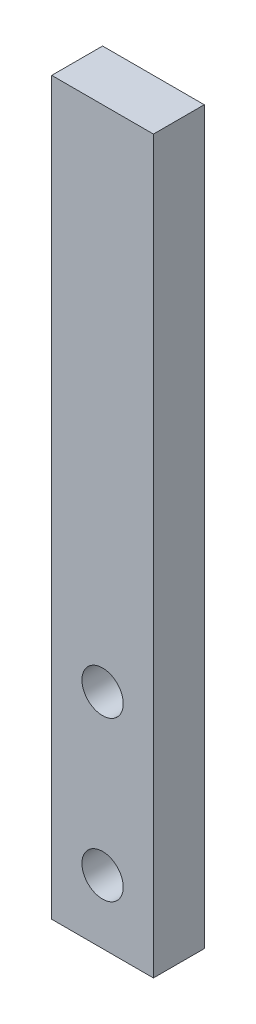
ISO-10303-21;
HEADER;
FILE_DESCRIPTION(('STEP AP214'),'2;1');
FILE_NAME('part.step','',(''),(''),'','','');
FILE_SCHEMA(('AUTOMOTIVE_DESIGN { 1 0 10303 214 1 1 1 1 }'));
ENDSEC;
DATA;
#1=APPLICATION_CONTEXT('core data for automotive mechanical design processes');
#2=APPLICATION_PROTOCOL_DEFINITION('international standard','automotive_design',2000,#1);
#3=PRODUCT_CONTEXT('',#1,'mechanical');
#4=PRODUCT('Part','Part','',(#3));
#5=PRODUCT_RELATED_PRODUCT_CATEGORY('part','',(#4));
#6=PRODUCT_DEFINITION_FORMATION('','',#4);
#7=PRODUCT_DEFINITION_CONTEXT('part definition',#1,'design');
#8=PRODUCT_DEFINITION('design','',#6,#7);
#9=PRODUCT_DEFINITION_SHAPE('','',#8);
#10=(LENGTH_UNIT() NAMED_UNIT(*) SI_UNIT(.MILLI.,.METRE.));
#11=(NAMED_UNIT(*) PLANE_ANGLE_UNIT() SI_UNIT($,.RADIAN.));
#12=(NAMED_UNIT(*) SI_UNIT($,.STERADIAN.) SOLID_ANGLE_UNIT());
#13=UNCERTAINTY_MEASURE_WITH_UNIT(LENGTH_MEASURE(1.E-05),#10,'distance_accuracy_value','');
#14=(GEOMETRIC_REPRESENTATION_CONTEXT(3) GLOBAL_UNCERTAINTY_ASSIGNED_CONTEXT((#13)) GLOBAL_UNIT_ASSIGNED_CONTEXT((#10,
#11,#12)) REPRESENTATION_CONTEXT('',''));
#15=CARTESIAN_POINT('',(0.,0.,0.));
#16=DIRECTION('',(0.,0.,1.));
#17=DIRECTION('',(1.,0.,0.));
#18=AXIS2_PLACEMENT_3D('',#15,#16,#17);
#19=CARTESIAN_POINT('',(8.,-57.5,8.));
#20=DIRECTION('',(0.,-1.,0.));
#21=DIRECTION('',(0.,0.,-1.));
#22=AXIS2_PLACEMENT_3D('',#19,#20,#21);
#23=PLANE('',#22);
#24=DIRECTION('',(-1.,0.,0.));
#25=VECTOR('',#24,1.);
#26=CARTESIAN_POINT('',(8.,-57.5,0.));
#27=LINE('',#26,#25);
#28=CARTESIAN_POINT('',(8.,-57.5,0.));
#29=VERTEX_POINT('',#28);
#30=CARTESIAN_POINT('',(-8.,-57.5,0.));
#31=VERTEX_POINT('',#30);
#32=EDGE_CURVE('E120',#29,#31,#27,.T.);
#33=ORIENTED_EDGE('',*,*,#32,.F.);
#34=DIRECTION('',(0.,0.,-1.));
#35=VECTOR('',#34,1.);
#36=CARTESIAN_POINT('',(8.,-57.5,8.));
#37=LINE('',#36,#35);
#38=CARTESIAN_POINT('',(8.,-57.5,8.));
#39=VERTEX_POINT('',#38);
#40=EDGE_CURVE('E11',#39,#29,#37,.T.);
#41=ORIENTED_EDGE('',*,*,#40,.F.);
#42=DIRECTION('',(-1.,0.,0.));
#43=VECTOR('',#42,1.);
#44=CARTESIAN_POINT('',(8.,-57.5,8.));
#45=LINE('',#44,#43);
#46=CARTESIAN_POINT('',(-8.,-57.5,8.));
#47=VERTEX_POINT('',#46);
#48=EDGE_CURVE('E109',#39,#47,#45,.T.);
#49=ORIENTED_EDGE('',*,*,#48,.T.);
#50=DIRECTION('',(0.,0.,-1.));
#51=VECTOR('',#50,1.);
#52=CARTESIAN_POINT('',(-8.,-57.5,8.));
#53=LINE('',#52,#51);
#54=EDGE_CURVE('E48',#47,#31,#53,.T.);
#55=ORIENTED_EDGE('',*,*,#54,.T.);
#56=EDGE_LOOP('',(#33,#41,#49,#55));
#57=FACE_BOUND('',#56,.T.);
#58=ADVANCED_FACE('F44',(#57),#23,.T.);
#59=CARTESIAN_POINT('',(8.,-57.5,8.));
#60=DIRECTION('',(-1.,0.,0.));
#61=DIRECTION('',(0.,0.,1.));
#62=AXIS2_PLACEMENT_3D('',#59,#60,#61);
#63=PLANE('',#62);
#64=DIRECTION('',(0.,1.,0.));
#65=VECTOR('',#64,1.);
#66=CARTESIAN_POINT('',(8.,-57.5,0.));
#67=LINE('',#66,#65);
#68=CARTESIAN_POINT('',(8.,57.5,0.));
#69=VERTEX_POINT('',#68);
#70=EDGE_CURVE('E80',#29,#69,#67,.T.);
#71=ORIENTED_EDGE('',*,*,#70,.T.);
#72=DIRECTION('',(0.,0.,-1.));
#73=VECTOR('',#72,1.);
#74=CARTESIAN_POINT('',(8.,57.5,8.));
#75=LINE('',#74,#73);
#76=CARTESIAN_POINT('',(8.,57.5,8.));
#77=VERTEX_POINT('',#76);
#78=EDGE_CURVE('E54',#77,#69,#75,.T.);
#79=ORIENTED_EDGE('',*,*,#78,.F.);
#80=DIRECTION('',(0.,1.,0.));
#81=VECTOR('',#80,1.);
#82=CARTESIAN_POINT('',(8.,-57.5,8.));
#83=LINE('',#82,#81);
#84=EDGE_CURVE('E96',#39,#77,#83,.T.);
#85=ORIENTED_EDGE('',*,*,#84,.F.);
#86=ORIENTED_EDGE('',*,*,#40,.T.);
#87=EDGE_LOOP('',(#71,#79,#85,#86));
#88=FACE_BOUND('',#87,.T.);
#89=ADVANCED_FACE('F132',(#88),#63,.F.);
#90=CARTESIAN_POINT('',(8.,57.5,8.));
#91=DIRECTION('',(0.,-1.,0.));
#92=DIRECTION('',(0.,0.,-1.));
#93=AXIS2_PLACEMENT_3D('',#90,#91,#92);
#94=PLANE('',#93);
#95=DIRECTION('',(-1.,0.,0.));
#96=VECTOR('',#95,1.);
#97=CARTESIAN_POINT('',(8.,57.5,0.));
#98=LINE('',#97,#96);
#99=CARTESIAN_POINT('',(-8.,57.5,0.));
#100=VERTEX_POINT('',#99);
#101=EDGE_CURVE('E101',#69,#100,#98,.T.);
#102=ORIENTED_EDGE('',*,*,#101,.T.);
#103=DIRECTION('',(0.,0.,-1.));
#104=VECTOR('',#103,1.);
#105=CARTESIAN_POINT('',(-8.,57.5,8.));
#106=LINE('',#105,#104);
#107=CARTESIAN_POINT('',(-8.,57.5,8.));
#108=VERTEX_POINT('',#107);
#109=EDGE_CURVE('E102',#108,#100,#106,.T.);
#110=ORIENTED_EDGE('',*,*,#109,.F.);
#111=DIRECTION('',(-1.,0.,0.));
#112=VECTOR('',#111,1.);
#113=CARTESIAN_POINT('',(8.,57.5,8.));
#114=LINE('',#113,#112);
#115=EDGE_CURVE('E91',#77,#108,#114,.T.);
#116=ORIENTED_EDGE('',*,*,#115,.F.);
#117=ORIENTED_EDGE('',*,*,#78,.T.);
#118=EDGE_LOOP('',(#102,#110,#116,#117));
#119=FACE_BOUND('',#118,.T.);
#120=ADVANCED_FACE('F105',(#119),#94,.F.);
#121=CARTESIAN_POINT('',(-8.,-57.5,8.));
#122=DIRECTION('',(-1.,0.,0.));
#123=DIRECTION('',(0.,0.,1.));
#124=AXIS2_PLACEMENT_3D('',#121,#122,#123);
#125=PLANE('',#124);
#126=DIRECTION('',(0.,1.,0.));
#127=VECTOR('',#126,1.);
#128=CARTESIAN_POINT('',(-8.,-57.5,0.));
#129=LINE('',#128,#127);
#130=EDGE_CURVE('E123',#31,#100,#129,.T.);
#131=ORIENTED_EDGE('',*,*,#130,.F.);
#132=ORIENTED_EDGE('',*,*,#54,.F.);
#133=DIRECTION('',(0.,1.,0.));
#134=VECTOR('',#133,1.);
#135=CARTESIAN_POINT('',(-8.,-57.5,8.));
#136=LINE('',#135,#134);
#137=EDGE_CURVE('E94',#47,#108,#136,.T.);
#138=ORIENTED_EDGE('',*,*,#137,.T.);
#139=ORIENTED_EDGE('',*,*,#109,.T.);
#140=EDGE_LOOP('',(#131,#132,#138,#139));
#141=FACE_BOUND('',#140,.T.);
#142=ADVANCED_FACE('F110',(#141),#125,.T.);
#143=CARTESIAN_POINT('',(0.,0.,8.));
#144=DIRECTION('',(0.,0.,-1.));
#145=DIRECTION('',(-1.,0.,0.));
#146=AXIS2_PLACEMENT_3D('',#143,#144,#145);
#147=PLANE('',#146);
#148=CARTESIAN_POINT('',(0.,-22.5,8.));
#149=DIRECTION('',(0.,0.,1.));
#150=DIRECTION('',(1.,0.,0.));
#151=AXIS2_PLACEMENT_3D('',#148,#149,#150);
#152=CIRCLE('',#151,3.25);
#153=CARTESIAN_POINT('',(3.25,-22.5,8.));
#154=VERTEX_POINT('',#153);
#155=EDGE_CURVE('E169',#154,#154,#152,.T.);
#156=ORIENTED_EDGE('',*,*,#155,.F.);
#157=EDGE_LOOP('',(#156));
#158=FACE_BOUND('',#157,.T.);
#159=CARTESIAN_POINT('',(0.,-47.5,8.));
#160=DIRECTION('',(0.,0.,1.));
#161=DIRECTION('',(1.,0.,0.));
#162=AXIS2_PLACEMENT_3D('',#159,#160,#161);
#163=CIRCLE('',#162,3.25);
#164=CARTESIAN_POINT('',(3.25,-47.5,8.));
#165=VERTEX_POINT('',#164);
#166=EDGE_CURVE('E175',#165,#165,#163,.T.);
#167=ORIENTED_EDGE('',*,*,#166,.F.);
#168=EDGE_LOOP('',(#167));
#169=FACE_BOUND('',#168,.T.);
#170=ORIENTED_EDGE('',*,*,#48,.F.);
#171=ORIENTED_EDGE('',*,*,#84,.T.);
#172=ORIENTED_EDGE('',*,*,#115,.T.);
#173=ORIENTED_EDGE('',*,*,#137,.F.);
#174=EDGE_LOOP('',(#170,#171,#172,#173));
#175=FACE_BOUND('',#174,.T.);
#176=ADVANCED_FACE('F92',(#158,#169,#175),#147,.F.);
#177=CARTESIAN_POINT('',(0.,0.,0.));
#178=DIRECTION('',(0.,0.,-1.));
#179=DIRECTION('',(-1.,0.,0.));
#180=AXIS2_PLACEMENT_3D('',#177,#178,#179);
#181=PLANE('',#180);
#182=CARTESIAN_POINT('',(0.,-22.5,0.));
#183=DIRECTION('',(0.,0.,1.));
#184=DIRECTION('',(1.,0.,0.));
#185=AXIS2_PLACEMENT_3D('',#182,#183,#184);
#186=CIRCLE('',#185,3.25);
#187=CARTESIAN_POINT('',(3.25,-22.5,0.));
#188=VERTEX_POINT('',#187);
#189=EDGE_CURVE('E122',#188,#188,#186,.T.);
#190=ORIENTED_EDGE('',*,*,#189,.T.);
#191=EDGE_LOOP('',(#190));
#192=FACE_BOUND('',#191,.T.);
#193=CARTESIAN_POINT('',(0.,-47.5,0.));
#194=DIRECTION('',(0.,0.,1.));
#195=DIRECTION('',(1.,0.,0.));
#196=AXIS2_PLACEMENT_3D('',#193,#194,#195);
#197=CIRCLE('',#196,3.25);
#198=CARTESIAN_POINT('',(3.25,-47.5,0.));
#199=VERTEX_POINT('',#198);
#200=EDGE_CURVE('E178',#199,#199,#197,.T.);
#201=ORIENTED_EDGE('',*,*,#200,.T.);
#202=EDGE_LOOP('',(#201));
#203=FACE_BOUND('',#202,.T.);
#204=ORIENTED_EDGE('',*,*,#32,.T.);
#205=ORIENTED_EDGE('',*,*,#130,.T.);
#206=ORIENTED_EDGE('',*,*,#101,.F.);
#207=ORIENTED_EDGE('',*,*,#70,.F.);
#208=EDGE_LOOP('',(#204,#205,#206,#207));
#209=FACE_BOUND('',#208,.T.);
#210=ADVANCED_FACE('F131',(#192,#203,#209),#181,.T.);
#211=CARTESIAN_POINT('',(0.,-47.5,0.));
#212=DIRECTION('',(0.,0.,1.));
#213=DIRECTION('',(1.,0.,0.));
#214=AXIS2_PLACEMENT_3D('',#211,#212,#213);
#215=CYLINDRICAL_SURFACE('',#214,3.25);
#216=ORIENTED_EDGE('',*,*,#200,.F.);
#217=EDGE_LOOP('',(#216));
#218=FACE_BOUND('',#217,.T.);
#219=ORIENTED_EDGE('',*,*,#166,.T.);
#220=EDGE_LOOP('',(#219));
#221=FACE_BOUND('',#220,.T.);
#222=ADVANCED_FACE('F153',(#218,#221),#215,.F.);
#223=CARTESIAN_POINT('',(0.,-22.5,0.));
#224=DIRECTION('',(0.,0.,1.));
#225=DIRECTION('',(1.,0.,0.));
#226=AXIS2_PLACEMENT_3D('',#223,#224,#225);
#227=CYLINDRICAL_SURFACE('',#226,3.25);
#228=ORIENTED_EDGE('',*,*,#189,.F.);
#229=EDGE_LOOP('',(#228));
#230=FACE_BOUND('',#229,.T.);
#231=ORIENTED_EDGE('',*,*,#155,.T.);
#232=EDGE_LOOP('',(#231));
#233=FACE_BOUND('',#232,.T.);
#234=ADVANCED_FACE('F158',(#230,#233),#227,.F.);
#235=CLOSED_SHELL('',(#58,#89,#120,#142,#176,#210,#222,#234));
#236=MANIFOLD_SOLID_BREP('B2',#235);
#237=ADVANCED_BREP_SHAPE_REPRESENTATION('',(#18,#236),#14);
#238=SHAPE_DEFINITION_REPRESENTATION(#9,#237);
ENDSEC;
END-ISO-10303-21;
